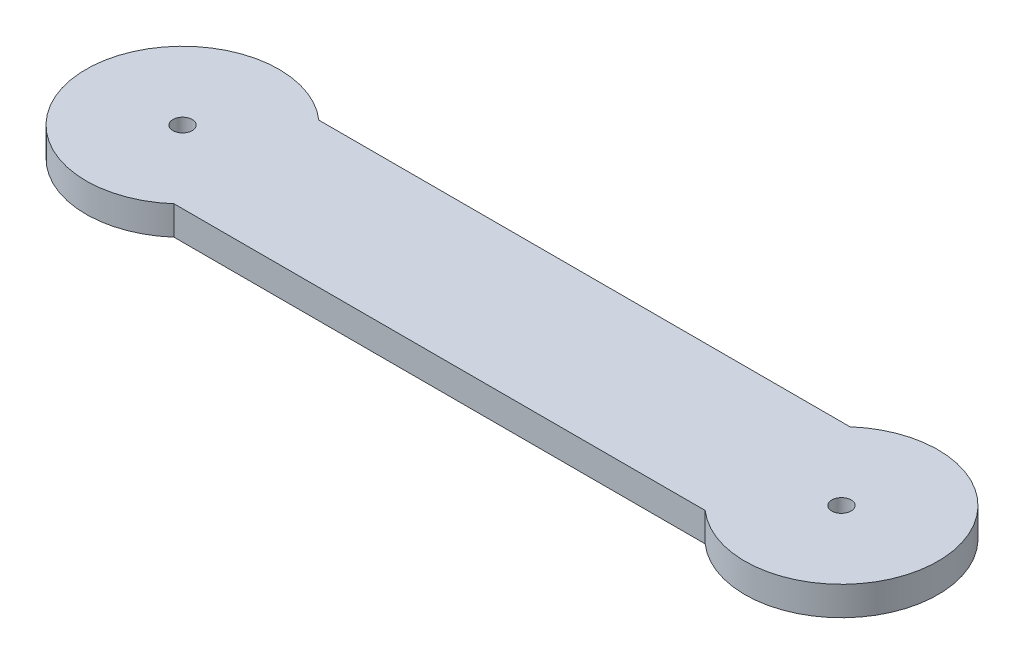
ISO-10303-21;
HEADER;
FILE_DESCRIPTION(('STEP AP214'),'2;1');
FILE_NAME('part.step','',(''),(''),'','','');
FILE_SCHEMA(('AUTOMOTIVE_DESIGN { 1 0 10303 214 1 1 1 1 }'));
ENDSEC;
DATA;
#1=APPLICATION_CONTEXT('core data for automotive mechanical design processes');
#2=APPLICATION_PROTOCOL_DEFINITION('international standard','automotive_design',2000,#1);
#3=PRODUCT_CONTEXT('',#1,'mechanical');
#4=PRODUCT('Part','Part','',(#3));
#5=PRODUCT_RELATED_PRODUCT_CATEGORY('part','',(#4));
#6=PRODUCT_DEFINITION_FORMATION('','',#4);
#7=PRODUCT_DEFINITION_CONTEXT('part definition',#1,'design');
#8=PRODUCT_DEFINITION('design','',#6,#7);
#9=PRODUCT_DEFINITION_SHAPE('','',#8);
#10=(LENGTH_UNIT() NAMED_UNIT(*) SI_UNIT(.MILLI.,.METRE.));
#11=(NAMED_UNIT(*) PLANE_ANGLE_UNIT() SI_UNIT($,.RADIAN.));
#12=(NAMED_UNIT(*) SI_UNIT($,.STERADIAN.) SOLID_ANGLE_UNIT());
#13=UNCERTAINTY_MEASURE_WITH_UNIT(LENGTH_MEASURE(1.E-05),#10,'distance_accuracy_value','');
#14=(GEOMETRIC_REPRESENTATION_CONTEXT(3) GLOBAL_UNCERTAINTY_ASSIGNED_CONTEXT((#13)) GLOBAL_UNIT_ASSIGNED_CONTEXT((#10,
#11,#12)) REPRESENTATION_CONTEXT('',''));
#15=CARTESIAN_POINT('',(0.,0.,0.));
#16=DIRECTION('',(0.,0.,1.));
#17=DIRECTION('',(1.,0.,0.));
#18=AXIS2_PLACEMENT_3D('',#15,#16,#17);
#19=CARTESIAN_POINT('',(6.61437827766148,3.,-7.5));
#20=DIRECTION('',(0.,-1.,0.));
#21=DIRECTION('',(0.,0.,-1.));
#22=AXIS2_PLACEMENT_3D('',#19,#20,#21);
#23=CYLINDRICAL_SURFACE('',#22,10.);
#24=CARTESIAN_POINT('',(6.61437827766148,0.,-7.5));
#25=DIRECTION('',(0.,1.,0.));
#26=DIRECTION('',(0.,0.,-1.));
#27=AXIS2_PLACEMENT_3D('',#24,#25,#26);
#28=CIRCLE('',#27,10.);
#29=CARTESIAN_POINT('',(0.,0.,0.));
#30=VERTEX_POINT('',#29);
#31=CARTESIAN_POINT('',(0.,0.,-15.));
#32=VERTEX_POINT('',#31);
#33=EDGE_CURVE('E103',#30,#32,#28,.T.);
#34=ORIENTED_EDGE('',*,*,#33,.T.);
#35=DIRECTION('',(0.,-1.,0.));
#36=VECTOR('',#35,1.);
#37=CARTESIAN_POINT('',(0.,3.,-15.));
#38=LINE('',#37,#36);
#39=CARTESIAN_POINT('',(0.,3.,-15.));
#40=VERTEX_POINT('',#39);
#41=EDGE_CURVE('E11',#40,#32,#38,.T.);
#42=ORIENTED_EDGE('',*,*,#41,.F.);
#43=CARTESIAN_POINT('',(6.61437827766148,3.,-7.5));
#44=DIRECTION('',(0.,1.,0.));
#45=DIRECTION('',(0.,0.,-1.));
#46=AXIS2_PLACEMENT_3D('',#43,#44,#45);
#47=CIRCLE('',#46,10.);
#48=CARTESIAN_POINT('',(0.,3.,0.));
#49=VERTEX_POINT('',#48);
#50=EDGE_CURVE('E90',#49,#40,#47,.T.);
#51=ORIENTED_EDGE('',*,*,#50,.F.);
#52=DIRECTION('',(0.,-1.,0.));
#53=VECTOR('',#52,1.);
#54=CARTESIAN_POINT('',(0.,3.,0.));
#55=LINE('',#54,#53);
#56=EDGE_CURVE('E99',#49,#30,#55,.T.);
#57=ORIENTED_EDGE('',*,*,#56,.T.);
#58=EDGE_LOOP('',(#34,#42,#51,#57));
#59=FACE_BOUND('',#58,.T.);
#60=ADVANCED_FACE('F37',(#59),#23,.T.);
#61=CARTESIAN_POINT('',(0.,3.,-15.));
#62=DIRECTION('',(0.,0.,1.));
#63=DIRECTION('',(1.,0.,0.));
#64=AXIS2_PLACEMENT_3D('',#61,#62,#63);
#65=PLANE('',#64);
#66=DIRECTION('',(-1.,0.,0.));
#67=VECTOR('',#66,1.);
#68=CARTESIAN_POINT('',(0.,0.,-15.));
#69=LINE('',#68,#67);
#70=CARTESIAN_POINT('',(-55.,0.,-15.));
#71=VERTEX_POINT('',#70);
#72=EDGE_CURVE('E94',#32,#71,#69,.T.);
#73=ORIENTED_EDGE('',*,*,#72,.T.);
#74=DIRECTION('',(0.,-1.,0.));
#75=VECTOR('',#74,1.);
#76=CARTESIAN_POINT('',(-55.,3.,-15.));
#77=LINE('',#76,#75);
#78=CARTESIAN_POINT('',(-55.,3.,-15.));
#79=VERTEX_POINT('',#78);
#80=EDGE_CURVE('E46',#79,#71,#77,.T.);
#81=ORIENTED_EDGE('',*,*,#80,.F.);
#82=DIRECTION('',(-1.,0.,0.));
#83=VECTOR('',#82,1.);
#84=CARTESIAN_POINT('',(0.,3.,-15.));
#85=LINE('',#84,#83);
#86=EDGE_CURVE('E85',#40,#79,#85,.T.);
#87=ORIENTED_EDGE('',*,*,#86,.F.);
#88=ORIENTED_EDGE('',*,*,#41,.T.);
#89=EDGE_LOOP('',(#73,#81,#87,#88));
#90=FACE_BOUND('',#89,.T.);
#91=ADVANCED_FACE('F93',(#90),#65,.F.);
#92=CARTESIAN_POINT('',(-61.6143782776615,3.,-7.49999999999999));
#93=DIRECTION('',(0.,-1.,0.));
#94=DIRECTION('',(0.,0.,-1.));
#95=AXIS2_PLACEMENT_3D('',#92,#93,#94);
#96=CYLINDRICAL_SURFACE('',#95,9.99999999999999);
#97=CARTESIAN_POINT('',(-61.6143782776615,0.,-7.49999999999999));
#98=DIRECTION('',(0.,1.,0.));
#99=DIRECTION('',(0.,0.,1.));
#100=AXIS2_PLACEMENT_3D('',#97,#98,#99);
#101=CIRCLE('',#100,9.99999999999999);
#102=CARTESIAN_POINT('',(-55.,0.,0.));
#103=VERTEX_POINT('',#102);
#104=EDGE_CURVE('E72',#71,#103,#101,.T.);
#105=ORIENTED_EDGE('',*,*,#104,.T.);
#106=DIRECTION('',(0.,-1.,0.));
#107=VECTOR('',#106,1.);
#108=CARTESIAN_POINT('',(-55.,3.,0.));
#109=LINE('',#108,#107);
#110=CARTESIAN_POINT('',(-55.,3.,0.));
#111=VERTEX_POINT('',#110);
#112=EDGE_CURVE('E95',#111,#103,#109,.T.);
#113=ORIENTED_EDGE('',*,*,#112,.F.);
#114=CARTESIAN_POINT('',(-61.6143782776615,3.,-7.49999999999999));
#115=DIRECTION('',(0.,1.,0.));
#116=DIRECTION('',(0.,0.,1.));
#117=AXIS2_PLACEMENT_3D('',#114,#115,#116);
#118=CIRCLE('',#117,9.99999999999999);
#119=EDGE_CURVE('E88',#79,#111,#118,.T.);
#120=ORIENTED_EDGE('',*,*,#119,.F.);
#121=ORIENTED_EDGE('',*,*,#80,.T.);
#122=EDGE_LOOP('',(#105,#113,#120,#121));
#123=FACE_BOUND('',#122,.T.);
#124=ADVANCED_FACE('F97',(#123),#96,.T.);
#125=CARTESIAN_POINT('',(0.,3.,0.));
#126=DIRECTION('',(0.,0.,-1.));
#127=DIRECTION('',(-1.,0.,0.));
#128=AXIS2_PLACEMENT_3D('',#125,#126,#127);
#129=PLANE('',#128);
#130=DIRECTION('',(1.,0.,0.));
#131=VECTOR('',#130,1.);
#132=CARTESIAN_POINT('',(0.,0.,0.));
#133=LINE('',#132,#131);
#134=EDGE_CURVE('E78',#103,#30,#133,.T.);
#135=ORIENTED_EDGE('',*,*,#134,.T.);
#136=ORIENTED_EDGE('',*,*,#56,.F.);
#137=DIRECTION('',(1.,0.,0.));
#138=VECTOR('',#137,1.);
#139=CARTESIAN_POINT('',(0.,3.,0.));
#140=LINE('',#139,#138);
#141=EDGE_CURVE('E55',#111,#49,#140,.T.);
#142=ORIENTED_EDGE('',*,*,#141,.F.);
#143=ORIENTED_EDGE('',*,*,#112,.T.);
#144=EDGE_LOOP('',(#135,#136,#142,#143));
#145=FACE_BOUND('',#144,.T.);
#146=ADVANCED_FACE('F129',(#145),#129,.F.);
#147=CARTESIAN_POINT('',(6.61437827766148,3.,-7.5));
#148=DIRECTION('',(0.,-1.,0.));
#149=DIRECTION('',(0.,0.,-1.));
#150=AXIS2_PLACEMENT_3D('',#147,#148,#149);
#151=PLANE('',#150);
#152=CARTESIAN_POINT('',(-61.6143782776615,3.,-7.49999999999999));
#153=DIRECTION('',(0.,1.,0.));
#154=DIRECTION('',(0.,0.,1.));
#155=AXIS2_PLACEMENT_3D('',#152,#153,#154);
#156=CIRCLE('',#155,0.999999999999998);
#157=CARTESIAN_POINT('',(-61.6143782776615,3.,-6.49999999999999));
#158=VERTEX_POINT('',#157);
#159=EDGE_CURVE('E112',#158,#158,#156,.T.);
#160=ORIENTED_EDGE('',*,*,#159,.F.);
#161=EDGE_LOOP('',(#160));
#162=FACE_BOUND('',#161,.T.);
#163=CARTESIAN_POINT('',(6.61437827766148,3.,-7.5));
#164=DIRECTION('',(0.,1.,0.));
#165=DIRECTION('',(0.,0.,1.));
#166=AXIS2_PLACEMENT_3D('',#163,#164,#165);
#167=CIRCLE('',#166,1.);
#168=CARTESIAN_POINT('',(6.61437827766148,3.,-6.5));
#169=VERTEX_POINT('',#168);
#170=EDGE_CURVE('E117',#169,#169,#167,.T.);
#171=ORIENTED_EDGE('',*,*,#170,.F.);
#172=EDGE_LOOP('',(#171));
#173=FACE_BOUND('',#172,.T.);
#174=ORIENTED_EDGE('',*,*,#50,.T.);
#175=ORIENTED_EDGE('',*,*,#86,.T.);
#176=ORIENTED_EDGE('',*,*,#119,.T.);
#177=ORIENTED_EDGE('',*,*,#141,.T.);
#178=EDGE_LOOP('',(#174,#175,#176,#177));
#179=FACE_BOUND('',#178,.T.);
#180=ADVANCED_FACE('F86',(#162,#173,#179),#151,.F.);
#181=CARTESIAN_POINT('',(6.61437827766148,0.,-7.5));
#182=DIRECTION('',(0.,-1.,0.));
#183=DIRECTION('',(0.,0.,-1.));
#184=AXIS2_PLACEMENT_3D('',#181,#182,#183);
#185=PLANE('',#184);
#186=CARTESIAN_POINT('',(-61.6143782776615,0.,-7.49999999999999));
#187=DIRECTION('',(0.,-1.,0.));
#188=DIRECTION('',(0.,0.,-1.));
#189=AXIS2_PLACEMENT_3D('',#186,#187,#188);
#190=CIRCLE('',#189,0.999999999999998);
#191=CARTESIAN_POINT('',(-61.6143782776615,0.,-8.49999999999999));
#192=VERTEX_POINT('',#191);
#193=EDGE_CURVE('E40',#192,#192,#190,.T.);
#194=ORIENTED_EDGE('',*,*,#193,.F.);
#195=EDGE_LOOP('',(#194));
#196=FACE_BOUND('',#195,.T.);
#197=CARTESIAN_POINT('',(6.61437827766148,0.,-7.5));
#198=DIRECTION('',(0.,-1.,0.));
#199=DIRECTION('',(0.,0.,-1.));
#200=AXIS2_PLACEMENT_3D('',#197,#198,#199);
#201=CIRCLE('',#200,1.);
#202=CARTESIAN_POINT('',(6.61437827766148,0.,-8.5));
#203=VERTEX_POINT('',#202);
#204=EDGE_CURVE('E110',#203,#203,#201,.T.);
#205=ORIENTED_EDGE('',*,*,#204,.F.);
#206=EDGE_LOOP('',(#205));
#207=FACE_BOUND('',#206,.T.);
#208=ORIENTED_EDGE('',*,*,#33,.F.);
#209=ORIENTED_EDGE('',*,*,#134,.F.);
#210=ORIENTED_EDGE('',*,*,#104,.F.);
#211=ORIENTED_EDGE('',*,*,#72,.F.);
#212=EDGE_LOOP('',(#208,#209,#210,#211));
#213=FACE_BOUND('',#212,.T.);
#214=ADVANCED_FACE('F128',(#196,#207,#213),#185,.T.);
#215=CARTESIAN_POINT('',(6.61437827766148,-20.,-7.5));
#216=DIRECTION('',(0.,1.,0.));
#217=DIRECTION('',(0.,0.,1.));
#218=AXIS2_PLACEMENT_3D('',#215,#216,#217);
#219=CYLINDRICAL_SURFACE('',#218,1.);
#220=ORIENTED_EDGE('',*,*,#204,.T.);
#221=EDGE_LOOP('',(#220));
#222=FACE_BOUND('',#221,.T.);
#223=ORIENTED_EDGE('',*,*,#170,.T.);
#224=EDGE_LOOP('',(#223));
#225=FACE_BOUND('',#224,.T.);
#226=ADVANCED_FACE('F125',(#222,#225),#219,.F.);
#227=CARTESIAN_POINT('',(-61.6143782776615,-20.,-7.49999999999999));
#228=DIRECTION('',(0.,1.,0.));
#229=DIRECTION('',(0.,0.,1.));
#230=AXIS2_PLACEMENT_3D('',#227,#228,#229);
#231=CYLINDRICAL_SURFACE('',#230,0.999999999999998);
#232=ORIENTED_EDGE('',*,*,#193,.T.);
#233=EDGE_LOOP('',(#232));
#234=FACE_BOUND('',#233,.T.);
#235=ORIENTED_EDGE('',*,*,#159,.T.);
#236=EDGE_LOOP('',(#235));
#237=FACE_BOUND('',#236,.T.);
#238=ADVANCED_FACE('F176',(#234,#237),#231,.F.);
#239=CLOSED_SHELL('',(#60,#91,#124,#146,#180,#214,#226,#238));
#240=MANIFOLD_SOLID_BREP('B2',#239);
#241=ADVANCED_BREP_SHAPE_REPRESENTATION('',(#18,#240),#14);
#242=SHAPE_DEFINITION_REPRESENTATION(#9,#241);
ENDSEC;
END-ISO-10303-21;
